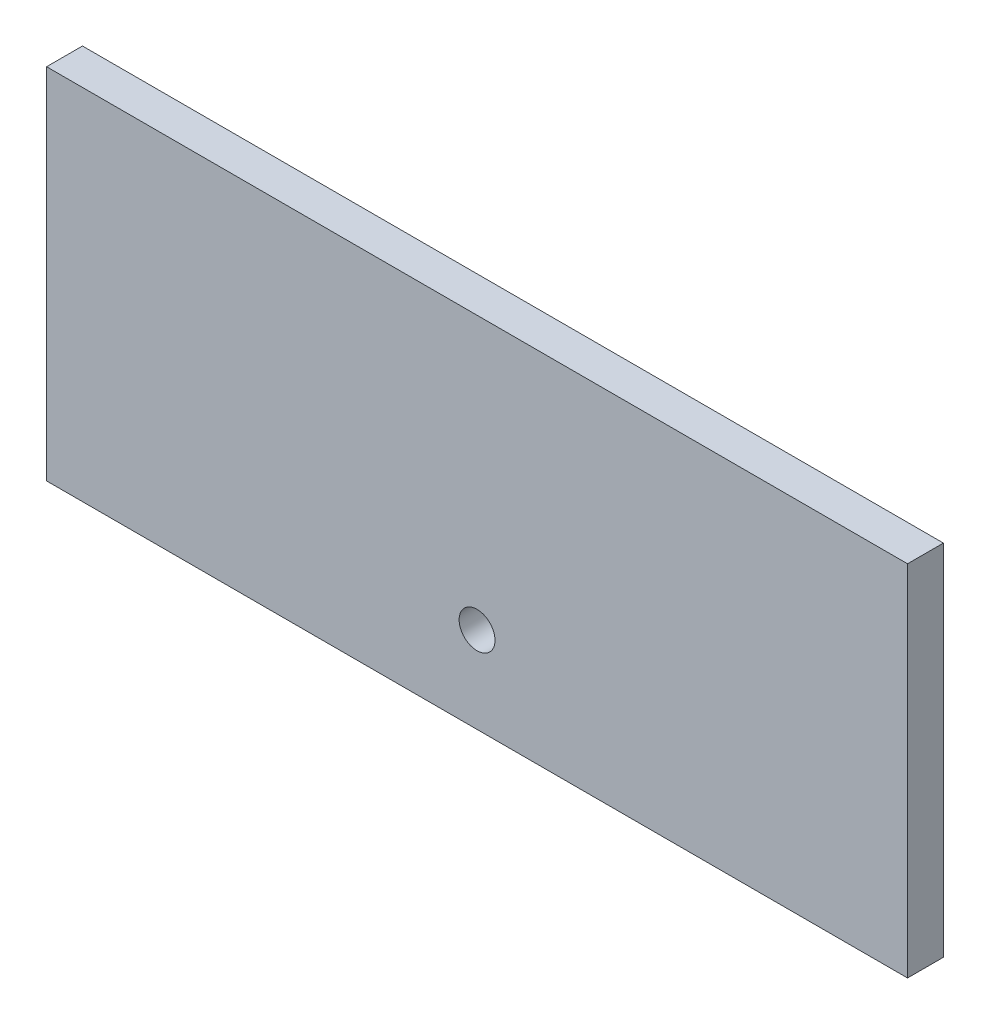
ISO-10303-21;
HEADER;
FILE_DESCRIPTION(('STEP AP214'),'2;1');
FILE_NAME('part.step','',(''),(''),'','','');
FILE_SCHEMA(('AUTOMOTIVE_DESIGN { 1 0 10303 214 1 1 1 1 }'));
ENDSEC;
DATA;
#1=APPLICATION_CONTEXT('core data for automotive mechanical design processes');
#2=APPLICATION_PROTOCOL_DEFINITION('international standard','automotive_design',2000,#1);
#3=PRODUCT_CONTEXT('',#1,'mechanical');
#4=PRODUCT('Part','Part','',(#3));
#5=PRODUCT_RELATED_PRODUCT_CATEGORY('part','',(#4));
#6=PRODUCT_DEFINITION_FORMATION('','',#4);
#7=PRODUCT_DEFINITION_CONTEXT('part definition',#1,'design');
#8=PRODUCT_DEFINITION('design','',#6,#7);
#9=PRODUCT_DEFINITION_SHAPE('','',#8);
#10=(LENGTH_UNIT() NAMED_UNIT(*) SI_UNIT(.MILLI.,.METRE.));
#11=(NAMED_UNIT(*) PLANE_ANGLE_UNIT() SI_UNIT($,.RADIAN.));
#12=(NAMED_UNIT(*) SI_UNIT($,.STERADIAN.) SOLID_ANGLE_UNIT());
#13=UNCERTAINTY_MEASURE_WITH_UNIT(LENGTH_MEASURE(1.E-05),#10,'distance_accuracy_value','');
#14=(GEOMETRIC_REPRESENTATION_CONTEXT(3) GLOBAL_UNCERTAINTY_ASSIGNED_CONTEXT((#13)) GLOBAL_UNIT_ASSIGNED_CONTEXT((#10,
#11,#12)) REPRESENTATION_CONTEXT('',''));
#15=CARTESIAN_POINT('',(0.,0.,0.));
#16=DIRECTION('',(0.,0.,1.));
#17=DIRECTION('',(1.,0.,0.));
#18=AXIS2_PLACEMENT_3D('',#15,#16,#17);
#19=CARTESIAN_POINT('',(0.,0.,6.35));
#20=DIRECTION('',(0.,0.,-1.));
#21=DIRECTION('',(-1.,0.,0.));
#22=AXIS2_PLACEMENT_3D('',#19,#20,#21);
#23=PLANE('',#22);
#24=DIRECTION('',(0.,-1.,0.));
#25=VECTOR('',#24,1.);
#26=CARTESIAN_POINT('',(0.,0.,6.35));
#27=LINE('',#26,#25);
#28=CARTESIAN_POINT('',(0.,63.5,6.35));
#29=VERTEX_POINT('',#28);
#30=CARTESIAN_POINT('',(0.,0.,6.35));
#31=VERTEX_POINT('',#30);
#32=EDGE_CURVE('E96',#29,#31,#27,.T.);
#33=ORIENTED_EDGE('',*,*,#32,.T.);
#34=DIRECTION('',(1.,0.,0.));
#35=VECTOR('',#34,1.);
#36=CARTESIAN_POINT('',(0.,0.,6.35));
#37=LINE('',#36,#35);
#38=CARTESIAN_POINT('',(152.4,0.,6.35));
#39=VERTEX_POINT('',#38);
#40=EDGE_CURVE('E91',#31,#39,#37,.T.);
#41=ORIENTED_EDGE('',*,*,#40,.T.);
#42=DIRECTION('',(0.,1.,0.));
#43=VECTOR('',#42,1.);
#44=CARTESIAN_POINT('',(152.4,0.,6.35));
#45=LINE('',#44,#43);
#46=CARTESIAN_POINT('',(152.4,63.5,6.35));
#47=VERTEX_POINT('',#46);
#48=EDGE_CURVE('E94',#39,#47,#45,.T.);
#49=ORIENTED_EDGE('',*,*,#48,.T.);
#50=DIRECTION('',(-1.,0.,0.));
#51=VECTOR('',#50,1.);
#52=CARTESIAN_POINT('',(0.,63.5,6.35));
#53=LINE('',#52,#51);
#54=EDGE_CURVE('E61',#47,#29,#53,.T.);
#55=ORIENTED_EDGE('',*,*,#54,.T.);
#56=EDGE_LOOP('',(#33,#41,#49,#55));
#57=FACE_BOUND('',#56,.T.);
#58=CARTESIAN_POINT('',(76.2,15.24,6.35));
#59=DIRECTION('',(0.,0.,1.));
#60=DIRECTION('',(1.,0.,0.));
#61=AXIS2_PLACEMENT_3D('',#58,#59,#60);
#62=CIRCLE('',#61,3.175);
#63=CARTESIAN_POINT('',(79.375,15.24,6.35));
#64=VERTEX_POINT('',#63);
#65=EDGE_CURVE('E116',#64,#64,#62,.T.);
#66=ORIENTED_EDGE('',*,*,#65,.F.);
#67=EDGE_LOOP('',(#66));
#68=FACE_BOUND('',#67,.T.);
#69=ADVANCED_FACE('F43',(#57,#68),#23,.F.);
#70=CARTESIAN_POINT('',(0.,0.,0.));
#71=DIRECTION('',(0.,0.,-1.));
#72=DIRECTION('',(-1.,0.,0.));
#73=AXIS2_PLACEMENT_3D('',#70,#71,#72);
#74=PLANE('',#73);
#75=DIRECTION('',(0.,-1.,0.));
#76=VECTOR('',#75,1.);
#77=CARTESIAN_POINT('',(0.,0.,0.));
#78=LINE('',#77,#76);
#79=CARTESIAN_POINT('',(0.,63.5,0.));
#80=VERTEX_POINT('',#79);
#81=CARTESIAN_POINT('',(0.,0.,0.));
#82=VERTEX_POINT('',#81);
#83=EDGE_CURVE('E112',#80,#82,#78,.T.);
#84=ORIENTED_EDGE('',*,*,#83,.F.);
#85=DIRECTION('',(-1.,0.,0.));
#86=VECTOR('',#85,1.);
#87=CARTESIAN_POINT('',(0.,63.5,0.));
#88=LINE('',#87,#86);
#89=CARTESIAN_POINT('',(152.4,63.5,0.));
#90=VERTEX_POINT('',#89);
#91=EDGE_CURVE('E84',#90,#80,#88,.T.);
#92=ORIENTED_EDGE('',*,*,#91,.F.);
#93=DIRECTION('',(0.,1.,0.));
#94=VECTOR('',#93,1.);
#95=CARTESIAN_POINT('',(152.4,0.,0.));
#96=LINE('',#95,#94);
#97=CARTESIAN_POINT('',(152.4,0.,0.));
#98=VERTEX_POINT('',#97);
#99=EDGE_CURVE('E78',#98,#90,#96,.T.);
#100=ORIENTED_EDGE('',*,*,#99,.F.);
#101=DIRECTION('',(1.,0.,0.));
#102=VECTOR('',#101,1.);
#103=CARTESIAN_POINT('',(0.,0.,0.));
#104=LINE('',#103,#102);
#105=EDGE_CURVE('E101',#82,#98,#104,.T.);
#106=ORIENTED_EDGE('',*,*,#105,.F.);
#107=EDGE_LOOP('',(#84,#92,#100,#106));
#108=FACE_BOUND('',#107,.T.);
#109=CARTESIAN_POINT('',(76.2,15.24,0.));
#110=DIRECTION('',(0.,0.,1.));
#111=DIRECTION('',(1.,0.,0.));
#112=AXIS2_PLACEMENT_3D('',#109,#110,#111);
#113=CIRCLE('',#112,3.175);
#114=CARTESIAN_POINT('',(79.375,15.24,0.));
#115=VERTEX_POINT('',#114);
#116=EDGE_CURVE('E134',#115,#115,#113,.T.);
#117=ORIENTED_EDGE('',*,*,#116,.T.);
#118=EDGE_LOOP('',(#117));
#119=FACE_BOUND('',#118,.T.);
#120=ADVANCED_FACE('F129',(#108,#119),#74,.T.);
#121=CARTESIAN_POINT('',(0.,0.,6.35));
#122=DIRECTION('',(1.,0.,0.));
#123=DIRECTION('',(0.,0.,-1.));
#124=AXIS2_PLACEMENT_3D('',#121,#122,#123);
#125=PLANE('',#124);
#126=ORIENTED_EDGE('',*,*,#83,.T.);
#127=DIRECTION('',(0.,0.,-1.));
#128=VECTOR('',#127,1.);
#129=CARTESIAN_POINT('',(0.,0.,6.35));
#130=LINE('',#129,#128);
#131=EDGE_CURVE('E11',#31,#82,#130,.T.);
#132=ORIENTED_EDGE('',*,*,#131,.F.);
#133=ORIENTED_EDGE('',*,*,#32,.F.);
#134=DIRECTION('',(0.,0.,-1.));
#135=VECTOR('',#134,1.);
#136=CARTESIAN_POINT('',(0.,63.5,6.35));
#137=LINE('',#136,#135);
#138=EDGE_CURVE('E108',#29,#80,#137,.T.);
#139=ORIENTED_EDGE('',*,*,#138,.T.);
#140=EDGE_LOOP('',(#126,#132,#133,#139));
#141=FACE_BOUND('',#140,.T.);
#142=ADVANCED_FACE('F45',(#141),#125,.F.);
#143=CARTESIAN_POINT('',(0.,0.,6.35));
#144=DIRECTION('',(0.,1.,0.));
#145=DIRECTION('',(0.,0.,1.));
#146=AXIS2_PLACEMENT_3D('',#143,#144,#145);
#147=PLANE('',#146);
#148=ORIENTED_EDGE('',*,*,#105,.T.);
#149=DIRECTION('',(0.,0.,-1.));
#150=VECTOR('',#149,1.);
#151=CARTESIAN_POINT('',(152.4,0.,6.35));
#152=LINE('',#151,#150);
#153=EDGE_CURVE('E53',#39,#98,#152,.T.);
#154=ORIENTED_EDGE('',*,*,#153,.F.);
#155=ORIENTED_EDGE('',*,*,#40,.F.);
#156=ORIENTED_EDGE('',*,*,#131,.T.);
#157=EDGE_LOOP('',(#148,#154,#155,#156));
#158=FACE_BOUND('',#157,.T.);
#159=ADVANCED_FACE('F100',(#158),#147,.F.);
#160=CARTESIAN_POINT('',(152.4,0.,6.35));
#161=DIRECTION('',(-1.,0.,0.));
#162=DIRECTION('',(0.,0.,1.));
#163=AXIS2_PLACEMENT_3D('',#160,#161,#162);
#164=PLANE('',#163);
#165=ORIENTED_EDGE('',*,*,#99,.T.);
#166=DIRECTION('',(0.,0.,-1.));
#167=VECTOR('',#166,1.);
#168=CARTESIAN_POINT('',(152.4,63.5,6.35));
#169=LINE('',#168,#167);
#170=EDGE_CURVE('E103',#47,#90,#169,.T.);
#171=ORIENTED_EDGE('',*,*,#170,.F.);
#172=ORIENTED_EDGE('',*,*,#48,.F.);
#173=ORIENTED_EDGE('',*,*,#153,.T.);
#174=EDGE_LOOP('',(#165,#171,#172,#173));
#175=FACE_BOUND('',#174,.T.);
#176=ADVANCED_FACE('F104',(#175),#164,.F.);
#177=CARTESIAN_POINT('',(0.,63.5,6.35));
#178=DIRECTION('',(0.,-1.,0.));
#179=DIRECTION('',(0.,0.,-1.));
#180=AXIS2_PLACEMENT_3D('',#177,#178,#179);
#181=PLANE('',#180);
#182=ORIENTED_EDGE('',*,*,#91,.T.);
#183=ORIENTED_EDGE('',*,*,#138,.F.);
#184=ORIENTED_EDGE('',*,*,#54,.F.);
#185=ORIENTED_EDGE('',*,*,#170,.T.);
#186=EDGE_LOOP('',(#182,#183,#184,#185));
#187=FACE_BOUND('',#186,.T.);
#188=ADVANCED_FACE('F126',(#187),#181,.F.);
#189=CARTESIAN_POINT('',(76.2,15.24,6.35));
#190=DIRECTION('',(0.,0.,-1.));
#191=DIRECTION('',(-1.,0.,0.));
#192=AXIS2_PLACEMENT_3D('',#189,#190,#191);
#193=CYLINDRICAL_SURFACE('',#192,3.175);
#194=ORIENTED_EDGE('',*,*,#65,.T.);
#195=EDGE_LOOP('',(#194));
#196=FACE_BOUND('',#195,.T.);
#197=ORIENTED_EDGE('',*,*,#116,.F.);
#198=EDGE_LOOP('',(#197));
#199=FACE_BOUND('',#198,.T.);
#200=ADVANCED_FACE('F142',(#196,#199),#193,.F.);
#201=CLOSED_SHELL('',(#69,#120,#142,#159,#176,#188,#200));
#202=MANIFOLD_SOLID_BREP('B2',#201);
#203=ADVANCED_BREP_SHAPE_REPRESENTATION('',(#18,#202),#14);
#204=SHAPE_DEFINITION_REPRESENTATION(#9,#203);
ENDSEC;
END-ISO-10303-21;
